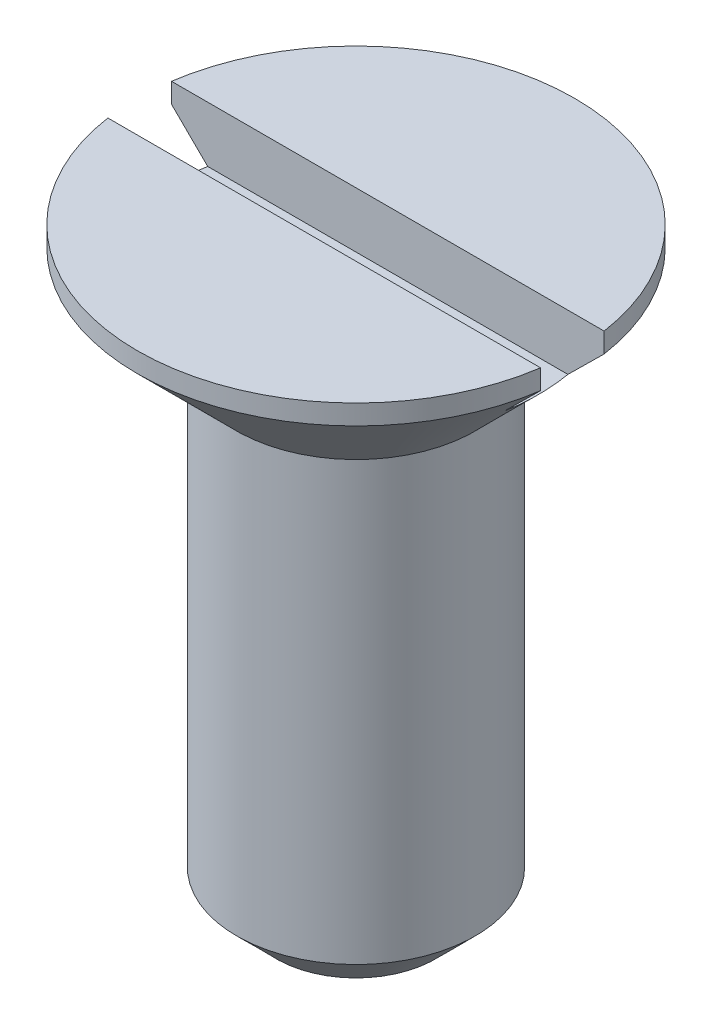
ISO-10303-21;
HEADER;
FILE_DESCRIPTION(('STEP AP214'),'2;1');
FILE_NAME('part.step','',(''),(''),'','','');
FILE_SCHEMA(('AUTOMOTIVE_DESIGN { 1 0 10303 214 1 1 1 1 }'));
ENDSEC;
DATA;
#1=APPLICATION_CONTEXT('core data for automotive mechanical design processes');
#2=APPLICATION_PROTOCOL_DEFINITION('international standard','automotive_design',2000,#1);
#3=PRODUCT_CONTEXT('',#1,'mechanical');
#4=PRODUCT('Part','Part','',(#3));
#5=PRODUCT_RELATED_PRODUCT_CATEGORY('part','',(#4));
#6=PRODUCT_DEFINITION_FORMATION('','',#4);
#7=PRODUCT_DEFINITION_CONTEXT('part definition',#1,'design');
#8=PRODUCT_DEFINITION('design','',#6,#7);
#9=PRODUCT_DEFINITION_SHAPE('','',#8);
#10=(LENGTH_UNIT() NAMED_UNIT(*) SI_UNIT(.MILLI.,.METRE.));
#11=(NAMED_UNIT(*) PLANE_ANGLE_UNIT() SI_UNIT($,.RADIAN.));
#12=(NAMED_UNIT(*) SI_UNIT($,.STERADIAN.) SOLID_ANGLE_UNIT());
#13=UNCERTAINTY_MEASURE_WITH_UNIT(LENGTH_MEASURE(1.E-05),#10,'distance_accuracy_value','');
#14=(GEOMETRIC_REPRESENTATION_CONTEXT(3) GLOBAL_UNCERTAINTY_ASSIGNED_CONTEXT((#13)) GLOBAL_UNIT_ASSIGNED_CONTEXT((#10,
#11,#12)) REPRESENTATION_CONTEXT('',''));
#15=CARTESIAN_POINT('',(0.,0.,0.));
#16=DIRECTION('',(0.,0.,1.));
#17=DIRECTION('',(1.,0.,0.));
#18=AXIS2_PLACEMENT_3D('',#15,#16,#17);
#19=CARTESIAN_POINT('',(0.,125.763182897862,0.));
#20=DIRECTION('',(0.,1.,0.));
#21=DIRECTION('',(-1.,0.,0.));
#22=AXIS2_PLACEMENT_3D('',#19,#20,#21);
#23=CYLINDRICAL_SURFACE('',#22,5.50000000000001);
#24=CARTESIAN_POINT('',(0.,91.5350422227853,0.));
#25=DIRECTION('',(0.,1.,0.));
#26=DIRECTION('',(-1.,0.,0.));
#27=AXIS2_PLACEMENT_3D('',#24,#25,#26);
#28=CIRCLE('',#27,5.50000000000001);
#29=CARTESIAN_POINT('',(5.44150714416512,91.5350422227853,-0.800000000000001));
#30=VERTEX_POINT('',#29);
#31=CARTESIAN_POINT('',(-5.44150714416514,91.5350422227853,-0.799999999999999));
#32=VERTEX_POINT('',#31);
#33=EDGE_CURVE('E103',#30,#32,#28,.T.);
#34=ORIENTED_EDGE('',*,*,#33,.T.);
#35=DIRECTION('',(0.,1.,0.));
#36=VECTOR('',#35,1.);
#37=CARTESIAN_POINT('',(-5.44150714416514,125.763182897862,-0.799999999999999));
#38=LINE('',#37,#36);
#39=CARTESIAN_POINT('',(-5.44150714416513,92.0350422227854,-0.799999999999999));
#40=VERTEX_POINT('',#39);
#41=EDGE_CURVE('E136',#32,#40,#38,.T.);
#42=ORIENTED_EDGE('',*,*,#41,.T.);
#43=CARTESIAN_POINT('',(0.,92.0350422227854,0.));
#44=DIRECTION('',(0.,1.,0.));
#45=DIRECTION('',(-1.,0.,0.));
#46=AXIS2_PLACEMENT_3D('',#43,#44,#45);
#47=CIRCLE('',#46,5.50000000000001);
#48=CARTESIAN_POINT('',(5.44150714416512,92.0350422227854,-0.800000000000001));
#49=VERTEX_POINT('',#48);
#50=EDGE_CURVE('E100',#49,#40,#47,.T.);
#51=ORIENTED_EDGE('',*,*,#50,.F.);
#52=DIRECTION('',(0.,1.,0.));
#53=VECTOR('',#52,1.);
#54=CARTESIAN_POINT('',(5.44150714416512,125.763182897862,-0.800000000000001));
#55=LINE('',#54,#53);
#56=EDGE_CURVE('E106',#49,#30,#55,.F.);
#57=ORIENTED_EDGE('',*,*,#56,.T.);
#58=EDGE_LOOP('',(#34,#42,#51,#57));
#59=FACE_BOUND('',#58,.T.);
#60=ADVANCED_FACE('F29',(#59),#23,.T.);
#61=CARTESIAN_POINT('',(0.,92.0350422227854,0.));
#62=DIRECTION('',(0.,-1.,0.));
#63=DIRECTION('',(1.,0.,0.));
#64=AXIS2_PLACEMENT_3D('',#61,#62,#63);
#65=PLANE('',#64);
#66=ORIENTED_EDGE('',*,*,#50,.T.);
#67=DIRECTION('',(1.,0.,0.));
#68=VECTOR('',#67,1.);
#69=CARTESIAN_POINT('',(0.,92.0350422227854,-0.8));
#70=LINE('',#69,#68);
#71=EDGE_CURVE('E88',#40,#49,#70,.T.);
#72=ORIENTED_EDGE('',*,*,#71,.T.);
#73=EDGE_LOOP('',(#66,#72));
#74=FACE_BOUND('',#73,.T.);
#75=ADVANCED_FACE('F162',(#74),#65,.F.);
#76=CARTESIAN_POINT('',(-5.44150714416514,91.5350422227853,0.800000000000001));
#77=VERTEX_POINT('',#76);
#78=CARTESIAN_POINT('',(5.44150714416512,91.5350422227853,0.799999999999999));
#79=VERTEX_POINT('',#78);
#80=EDGE_CURVE('E89',#77,#79,#28,.T.);
#81=ORIENTED_EDGE('',*,*,#80,.T.);
#82=DIRECTION('',(0.,1.,0.));
#83=VECTOR('',#82,1.);
#84=CARTESIAN_POINT('',(5.44150714416512,125.763182897862,0.799999999999999));
#85=LINE('',#84,#83);
#86=CARTESIAN_POINT('',(5.44150714416512,92.0350422227854,0.799999999999999));
#87=VERTEX_POINT('',#86);
#88=EDGE_CURVE('E83',#79,#87,#85,.T.);
#89=ORIENTED_EDGE('',*,*,#88,.T.);
#90=CARTESIAN_POINT('',(-5.44150714416513,92.0350422227854,0.800000000000001));
#91=VERTEX_POINT('',#90);
#92=EDGE_CURVE('E93',#91,#87,#47,.T.);
#93=ORIENTED_EDGE('',*,*,#92,.F.);
#94=DIRECTION('',(0.,1.,0.));
#95=VECTOR('',#94,1.);
#96=CARTESIAN_POINT('',(-5.44150714416514,125.763182897862,0.800000000000001));
#97=LINE('',#96,#95);
#98=EDGE_CURVE('E44',#91,#77,#97,.F.);
#99=ORIENTED_EDGE('',*,*,#98,.T.);
#100=EDGE_LOOP('',(#81,#89,#93,#99));
#101=FACE_BOUND('',#100,.T.);
#102=ADVANCED_FACE('F31',(#101),#23,.T.);
#103=CARTESIAN_POINT('',(0.,89.0350422227853,0.));
#104=DIRECTION('',(0.,1.,0.));
#105=DIRECTION('',(-1.,0.,0.));
#106=AXIS2_PLACEMENT_3D('',#103,#104,#105);
#107=CONICAL_SURFACE('',#106,3.00000000000001,0.785398163397448);
#108=ORIENTED_EDGE('',*,*,#33,.F.);
#109=CARTESIAN_POINT('',(12.0958275262002,98.1572962847815,-0.800000000000001));
#110=CARTESIAN_POINT('',(11.6791372892174,97.7415215826676,-0.800000000000001));
#111=CARTESIAN_POINT('',(11.262407013586,97.3257869805094,-0.800000000000001));
#112=CARTESIAN_POINT('',(10.4288064089983,96.4944409069096,-0.800000000000001));
#113=CARTESIAN_POINT('',(10.0119360773137,96.0788294382037,-0.800000000000001));
#114=CARTESIAN_POINT('',(9.17781661346985,95.2475944397484,-0.800000000000001));
#115=CARTESIAN_POINT('',(8.76056739536413,94.831970996228,-0.800000000000001));
#116=CARTESIAN_POINT('',(7.92579826190202,94.001012925459,-0.800000000000001));
#117=CARTESIAN_POINT('',(7.50827835219483,93.5856782925356,-0.800000000000001));
#118=CARTESIAN_POINT('',(6.66859020063421,92.7512768926174,-0.800000000000001));
#119=CARTESIAN_POINT('',(6.24641747129162,92.3322146386244,-0.800000000000001));
#120=CARTESIAN_POINT('',(5.61252961614655,91.7042292336917,-0.800000000000001));
#121=CARTESIAN_POINT('',(5.40112222087695,91.49499553239,-0.800000000000001));
#122=CARTESIAN_POINT('',(4.97801512356286,91.0768264844013,-0.800000000000001));
#123=CARTESIAN_POINT('',(4.76631542336044,90.8678911358507,-0.800000000000001));
#124=CARTESIAN_POINT('',(4.34255119804019,90.4505148402451,-0.800000000000001));
#125=CARTESIAN_POINT('',(4.13048679820865,90.2420737661013,-0.8));
#126=CARTESIAN_POINT('',(3.70568926936662,89.8258638515093,-0.8));
#127=CARTESIAN_POINT('',(3.49295612440394,89.6180950273405,-0.8));
#128=CARTESIAN_POINT('',(3.06642735602863,89.203693770451,-0.8));
#129=CARTESIAN_POINT('',(2.85263185208169,88.9970612152226,-0.8));
#130=CARTESIAN_POINT('',(2.53040594426324,88.6887211014235,-0.8));
#131=CARTESIAN_POINT('',(2.42274398077204,88.5862111666668,-0.8));
#132=CARTESIAN_POINT('',(2.20667154342435,88.381983944839,-0.8));
#133=CARTESIAN_POINT('',(2.09826108039959,88.2802666463425,-0.8));
#134=CARTESIAN_POINT('',(1.93012261572953,88.1242748325973,-0.8));
#135=CARTESIAN_POINT('',(1.87079515267859,88.0695688501408,-0.8));
#136=CARTESIAN_POINT('',(1.75170454598611,87.9606297428371,-0.8));
#137=CARTESIAN_POINT('',(1.691941392756,87.9063966284546,-0.8));
#138=CARTESIAN_POINT('',(1.57185035487716,87.7985656103778,-0.8));
#139=CARTESIAN_POINT('',(1.51152250462597,87.7449676684379,-0.8));
#140=CARTESIAN_POINT('',(1.39010636610856,87.6386421055215,-0.8));
#141=CARTESIAN_POINT('',(1.32901811231746,87.5859144453384,-0.8));
#142=CARTESIAN_POINT('',(1.22110258949384,87.4946595611788,-0.8));
#143=CARTESIAN_POINT('',(1.17450544952835,87.4558608083995,-0.8));
#144=CARTESIAN_POINT('',(1.08053310046028,87.3792189105197,-0.8));
#145=CARTESIAN_POINT('',(1.03315793637708,87.3413757104465,-0.8));
#146=CARTESIAN_POINT('',(0.937335315959471,87.2669844593189,-0.8));
#147=CARTESIAN_POINT('',(0.888887046591645,87.2304374489248,-0.8));
#148=CARTESIAN_POINT('',(0.790599923251047,87.1592755180035,-0.8));
#149=CARTESIAN_POINT('',(0.740761470882523,87.1246600479767,-0.8));
#150=CARTESIAN_POINT('',(0.629334035248598,87.0518666759528,-0.8));
#151=CARTESIAN_POINT('',(0.567339937782394,87.0142988477261,-0.8));
#152=CARTESIAN_POINT('',(0.439504114180291,86.9462180718728,-0.8));
#153=CARTESIAN_POINT('',(0.37366936762007,86.9156927972694,-0.8));
#154=CARTESIAN_POINT('',(0.258743036693742,86.8747196206057,-0.8));
#155=CARTESIAN_POINT('',(0.210872557785138,86.8609775664057,-0.8));
#156=CARTESIAN_POINT('',(0.113581927406563,86.8416725155943,-0.8));
#157=CARTESIAN_POINT('',(0.0641678120705799,86.836080949733,-0.8));
#158=CARTESIAN_POINT('',(-0.0350904401592112,86.8342676856272,-0.8));
#159=CARTESIAN_POINT('',(-0.0849354933242964,86.8380927493839,-0.8));
#160=CARTESIAN_POINT('',(-0.183253006607992,86.8543125472453,-0.8));
#161=CARTESIAN_POINT('',(-0.23172141942561,86.8667302766003,-0.8));
#162=CARTESIAN_POINT('',(-0.328201336074364,86.8984972300914,-0.8));
#163=CARTESIAN_POINT('',(-0.376131007814257,86.9180837874778,-0.8));
#164=CARTESIAN_POINT('',(-0.469859968725569,86.9618903544032,-0.8));
#165=CARTESIAN_POINT('',(-0.515655200140517,86.9861187748849,-0.8));
#166=CARTESIAN_POINT('',(-0.605816891933558,87.0378591148949,-0.8));
#167=CARTESIAN_POINT('',(-0.650168610045637,87.0653962598678,-0.8));
#168=CARTESIAN_POINT('',(-0.737426470346453,87.1225692235801,-0.8));
#169=CARTESIAN_POINT('',(-0.780333816480496,87.1522032271962,-0.8));
#170=CARTESIAN_POINT('',(-0.868736948412851,87.2155817657817,-0.8));
#171=CARTESIAN_POINT('',(-0.914136036146888,87.2494602261302,-0.8));
#172=CARTESIAN_POINT('',(-1.00398332100103,87.3184596561436,-0.8));
#173=CARTESIAN_POINT('',(-1.04843138737396,87.3535807949139,-0.8));
#174=CARTESIAN_POINT('',(-1.18073892841146,87.4603132765048,-0.8));
#175=CARTESIAN_POINT('',(-1.26751723571054,87.533260654317,-0.8));
#176=CARTESIAN_POINT('',(-1.4394711844844,87.6813088714842,-0.8));
#177=CARTESIAN_POINT('',(-1.52464359732235,87.7564134124352,-0.8));
#178=CARTESIAN_POINT('',(-1.69380590081402,87.9078909999617,-0.8));
#179=CARTESIAN_POINT('',(-1.77779613016842,87.9842636689578,-0.8));
#180=CARTESIAN_POINT('',(-1.94473042754187,88.1376356698917,-0.8));
#181=CARTESIAN_POINT('',(-2.02767689634403,88.2146323977702,-0.8));
#182=CARTESIAN_POINT('',(-2.1930126401925,88.3692331860143,-0.8));
#183=CARTESIAN_POINT('',(-2.27540187388798,88.4468372905496,-0.8));
#184=CARTESIAN_POINT('',(-2.43967433471674,88.602398051522,-0.8));
#185=CARTESIAN_POINT('',(-2.52155801918567,88.680354225575,-0.8));
#186=CARTESIAN_POINT('',(-2.68500793782888,88.8365943696214,-0.8));
#187=CARTESIAN_POINT('',(-2.76657417984415,88.9148783314178,-0.8));
#188=CARTESIAN_POINT('',(-3.01014515950732,89.1493693494808,-0.8));
#189=CARTESIAN_POINT('',(-3.17179220340449,89.3059478221063,-0.8));
#190=CARTESIAN_POINT('',(-3.49447839328541,89.6197302278361,-0.8));
#191=CARTESIAN_POINT('',(-3.65551753661504,89.7769341636652,-0.8));
#192=CARTESIAN_POINT('',(-4.13803429466081,90.2491722298893,-0.8));
#193=CARTESIAN_POINT('',(-4.45890481049126,90.564826393352,-0.799999999999999));
#194=CARTESIAN_POINT('',(-5.09996114740416,91.1971060949273,-0.799999999999999));
#195=CARTESIAN_POINT('',(-5.42014660990474,91.5137319958748,-0.799999999999999));
#196=CARTESIAN_POINT('',(-6.0600203413012,92.1474797989783,-0.799999999999999));
#197=CARTESIAN_POINT('',(-6.37970861482775,92.4646016964588,-0.799999999999999));
#198=CARTESIAN_POINT('',(-7.01874857086325,93.099135144032,-0.799999999999999));
#199=CARTESIAN_POINT('',(-7.33810027738054,93.4165466699576,-0.799999999999999));
#200=CARTESIAN_POINT('',(-7.97659251223353,94.0515836009857,-0.799999999999999));
#201=CARTESIAN_POINT('',(-8.29573304004776,94.3692090066125,-0.799999999999999));
#202=CARTESIAN_POINT('',(-9.25286524024317,95.3222371870014,-0.799999999999999));
#203=CARTESIAN_POINT('',(-9.89063691675411,95.9578608876388,-0.799999999999999));
#204=CARTESIAN_POINT('',(-10.6589067290098,96.7239244030984,-0.799999999999999));
#205=CARTESIAN_POINT('',(-10.7895564808174,96.8542122457665,-0.799999999999999));
#206=CARTESIAN_POINT('',(-11.0508453982938,97.1148026358098,-0.799999999999999));
#207=CARTESIAN_POINT('',(-11.1814845637648,97.245105183383,-0.799999999999999));
#208=CARTESIAN_POINT('',(-11.4427478912807,97.5057176577888,-0.799999999999999));
#209=CARTESIAN_POINT('',(-11.5733720536532,97.636027584293,-0.799999999999999));
#210=CARTESIAN_POINT('',(-11.8346081759352,97.8966555755888,-0.799999999999999));
#211=CARTESIAN_POINT('',(-11.9652201360038,98.0269736402209,-0.799999999999998));
#212=CARTESIAN_POINT('',(-12.0958275262002,98.1572962847815,-0.799999999999999));
#213=B_SPLINE_CURVE_WITH_KNOTS('',3,(#109,#110,#111,#112,#113,#114,#115,#116,#117,#118,#119,
#120,#121,#122,#123,#124,#125,#126,#127,#128,#129,#130,#131,#132,#133,#134,#135,#136,#137,#138,
#139,#140,#141,#142,#143,#144,#145,#146,#147,#148,#149,#150,#151,#152,#153,#154,#155,#156,#157,
#158,#159,#160,#161,#162,#163,#164,#165,#166,#167,#168,#169,#170,#171,#172,#173,#174,#175,#176,
#177,#178,#179,#180,#181,#182,#183,#184,#185,#186,#187,#188,#189,#190,#191,#192,#193,#194,#195,
#196,#197,#198,#199,#200,#201,#202,#203,#204,#205,#206,#207,#208,#209,#210,#211,#212),
.UNSPECIFIED.,.F.,.F.,(4,2,2,2,2,2,2,2,2,2,2,2,2,2,2,2,2,2,2,2,2,2,2,2,2,2,2,2,2,2,2,2,2,2,2,2,
2,2,2,2,2,2,2,2,2,2,2,2,2,2,2,4),(0.,1.7659259029987,3.53188847173551,5.29868145901929,
7.06543869037486,8.849979011941,9.74230522915776,10.6346258484434,11.526684619259,
12.4187648331258,13.3107469028989,13.7567205444878,14.2026877457437,14.4447859615782,
14.6868895216316,14.9289784291063,15.1710564004659,15.3529532463517,15.5348396038383,
15.7168688291973,15.8988460026461,16.1160971845527,16.3329651646567,16.4818476866973,
16.6302070773488,16.7793046899972,16.9288028610127,17.0837794880115,17.2390396311443,
17.3955691356675,17.5519647617409,17.7218741892633,17.8918068278933,18.2318382348004,
18.572492810384,18.9130477144395,19.2525694556765,19.5921161213406,19.9312888470232,
20.270453141111,20.9455938509771,21.6207375051469,22.9710516567342,24.3219532270977,
25.6728421392951,27.0236270977012,28.3744153793802,31.0756984573674,31.6292312195474,
32.1827726428839,32.7362978349177,33.2898143552011),.UNSPECIFIED.);
#214=CARTESIAN_POINT('',(4.52990066116246,90.6350422227854,-0.800000000000001));
#215=VERTEX_POINT('',#214);
#216=EDGE_CURVE('E52',#30,#215,#213,.T.);
#217=ORIENTED_EDGE('',*,*,#216,.T.);
#218=CARTESIAN_POINT('',(0.,90.6350422227854,0.));
#219=DIRECTION('',(0.,1.,0.));
#220=DIRECTION('',(0.,0.,1.));
#221=AXIS2_PLACEMENT_3D('',#218,#219,#220);
#222=CIRCLE('',#221,4.60000000000001);
#223=CARTESIAN_POINT('',(4.52990066116246,90.6350422227854,0.799999999999999));
#224=VERTEX_POINT('',#223);
#225=EDGE_CURVE('E115',#224,#215,#222,.T.);
#226=ORIENTED_EDGE('',*,*,#225,.F.);
#227=CARTESIAN_POINT('',(-12.0958275262002,98.1572962847815,0.800000000000001));
#228=CARTESIAN_POINT('',(-11.6791372892174,97.7415215826676,0.800000000000001));
#229=CARTESIAN_POINT('',(-11.2624070135861,97.3257869805094,0.800000000000001));
#230=CARTESIAN_POINT('',(-10.4288064089984,96.4944409069096,0.800000000000001));
#231=CARTESIAN_POINT('',(-10.0119360773137,96.0788294382037,0.800000000000001));
#232=CARTESIAN_POINT('',(-9.17781661346986,95.2475944397484,0.800000000000001));
#233=CARTESIAN_POINT('',(-8.76056739536414,94.831970996228,0.800000000000001));
#234=CARTESIAN_POINT('',(-7.92579826190204,94.001012925459,0.800000000000001));
#235=CARTESIAN_POINT('',(-7.50827835219485,93.5856782925356,0.800000000000001));
#236=CARTESIAN_POINT('',(-6.66859020063422,92.7512768926174,0.800000000000001));
#237=CARTESIAN_POINT('',(-6.24641747129163,92.3322146386244,0.800000000000001));
#238=CARTESIAN_POINT('',(-5.61252961614657,91.7042292336917,0.800000000000001));
#239=CARTESIAN_POINT('',(-5.40112222087697,91.49499553239,0.800000000000001));
#240=CARTESIAN_POINT('',(-4.97801512356287,91.0768264844013,0.800000000000001));
#241=CARTESIAN_POINT('',(-4.76631542336046,90.8678911358507,0.8));
#242=CARTESIAN_POINT('',(-4.3425511980402,90.4505148402451,0.8));
#243=CARTESIAN_POINT('',(-4.13048679820866,90.2420737661013,0.8));
#244=CARTESIAN_POINT('',(-3.70568926936663,89.8258638515093,0.8));
#245=CARTESIAN_POINT('',(-3.49295612440395,89.6180950273405,0.8));
#246=CARTESIAN_POINT('',(-3.06642735602864,89.203693770451,0.8));
#247=CARTESIAN_POINT('',(-2.8526318520817,88.9970612152226,0.8));
#248=CARTESIAN_POINT('',(-2.53040594426326,88.6887211014235,0.8));
#249=CARTESIAN_POINT('',(-2.42274398077206,88.5862111666668,0.8));
#250=CARTESIAN_POINT('',(-2.20667154342437,88.381983944839,0.8));
#251=CARTESIAN_POINT('',(-2.09826108039961,88.2802666463425,0.8));
#252=CARTESIAN_POINT('',(-1.93012261572954,88.1242748325973,0.8));
#253=CARTESIAN_POINT('',(-1.8707951526786,88.0695688501408,0.8));
#254=CARTESIAN_POINT('',(-1.75170454598612,87.9606297428371,0.8));
#255=CARTESIAN_POINT('',(-1.69194139275601,87.9063966284546,0.8));
#256=CARTESIAN_POINT('',(-1.57185035487717,87.7985656103778,0.8));
#257=CARTESIAN_POINT('',(-1.51152250462598,87.7449676684379,0.8));
#258=CARTESIAN_POINT('',(-1.39010636610857,87.6386421055214,0.8));
#259=CARTESIAN_POINT('',(-1.32901811231746,87.5859144453384,0.8));
#260=CARTESIAN_POINT('',(-1.22110258949385,87.4946595611788,0.8));
#261=CARTESIAN_POINT('',(-1.17450544952835,87.4558608083995,0.8));
#262=CARTESIAN_POINT('',(-1.08053310046029,87.3792189105197,0.8));
#263=CARTESIAN_POINT('',(-1.03315793637708,87.3413757104465,0.8));
#264=CARTESIAN_POINT('',(-0.93733531595947,87.2669844593189,0.8));
#265=CARTESIAN_POINT('',(-0.888887046591645,87.2304374489248,0.8));
#266=CARTESIAN_POINT('',(-0.790599923251052,87.1592755180035,0.8));
#267=CARTESIAN_POINT('',(-0.740761470882531,87.1246600479767,0.8));
#268=CARTESIAN_POINT('',(-0.629334035248611,87.0518666759528,0.8));
#269=CARTESIAN_POINT('',(-0.567339937782408,87.0142988477261,0.8));
#270=CARTESIAN_POINT('',(-0.439504114180306,86.9462180718728,0.8));
#271=CARTESIAN_POINT('',(-0.373669367620083,86.9156927972694,0.8));
#272=CARTESIAN_POINT('',(-0.258743036693755,86.8747196206057,0.8));
#273=CARTESIAN_POINT('',(-0.21087255778515,86.8609775664057,0.8));
#274=CARTESIAN_POINT('',(-0.113581927406576,86.8416725155943,0.8));
#275=CARTESIAN_POINT('',(-0.0641678120705924,86.836080949733,0.8));
#276=CARTESIAN_POINT('',(0.0350904401591986,86.8342676856272,0.8));
#277=CARTESIAN_POINT('',(0.0849354933242838,86.8380927493839,0.8));
#278=CARTESIAN_POINT('',(0.183253006607979,86.8543125472453,0.8));
#279=CARTESIAN_POINT('',(0.231721419425598,86.8667302766003,0.8));
#280=CARTESIAN_POINT('',(0.328201336074352,86.8984972300914,0.8));
#281=CARTESIAN_POINT('',(0.376131007814245,86.9180837874778,0.8));
#282=CARTESIAN_POINT('',(0.469859968725557,86.9618903544032,0.8));
#283=CARTESIAN_POINT('',(0.515655200140506,86.9861187748849,0.8));
#284=CARTESIAN_POINT('',(0.605816891933547,87.0378591148949,0.8));
#285=CARTESIAN_POINT('',(0.650168610045625,87.0653962598678,0.8));
#286=CARTESIAN_POINT('',(0.73742647034644,87.1225692235801,0.8));
#287=CARTESIAN_POINT('',(0.780333816480482,87.1522032271962,0.8));
#288=CARTESIAN_POINT('',(0.868736948412836,87.2155817657817,0.8));
#289=CARTESIAN_POINT('',(0.914136036146873,87.2494602261302,0.8));
#290=CARTESIAN_POINT('',(1.00398332100101,87.3184596561436,0.8));
#291=CARTESIAN_POINT('',(1.04843138737394,87.3535807949138,0.8));
#292=CARTESIAN_POINT('',(1.18073892841143,87.4603132765048,0.8));
#293=CARTESIAN_POINT('',(1.26751723571053,87.533260654317,0.8));
#294=CARTESIAN_POINT('',(1.4394711844844,87.6813088714842,0.8));
#295=CARTESIAN_POINT('',(1.52464359732235,87.7564134124352,0.8));
#296=CARTESIAN_POINT('',(1.69380590081401,87.9078909999617,0.8));
#297=CARTESIAN_POINT('',(1.77779613016841,87.9842636689578,0.8));
#298=CARTESIAN_POINT('',(1.94473042754187,88.1376356698917,0.8));
#299=CARTESIAN_POINT('',(2.02767689634403,88.2146323977702,0.8));
#300=CARTESIAN_POINT('',(2.19301264019249,88.3692331860144,0.8));
#301=CARTESIAN_POINT('',(2.27540187388797,88.4468372905496,0.8));
#302=CARTESIAN_POINT('',(2.43967433471673,88.602398051522,0.8));
#303=CARTESIAN_POINT('',(2.52155801918566,88.680354225575,0.8));
#304=CARTESIAN_POINT('',(2.68500793782887,88.8365943696214,0.8));
#305=CARTESIAN_POINT('',(2.76657417984414,88.9148783314178,0.8));
#306=CARTESIAN_POINT('',(3.01014515950731,89.1493693494808,0.8));
#307=CARTESIAN_POINT('',(3.17179220340447,89.3059478221063,0.799999999999999));
#308=CARTESIAN_POINT('',(3.4944783932854,89.6197302278361,0.799999999999999));
#309=CARTESIAN_POINT('',(3.65551753661503,89.7769341636652,0.799999999999999));
#310=CARTESIAN_POINT('',(4.13803429466079,90.2491722298893,0.799999999999999));
#311=CARTESIAN_POINT('',(4.45890481049124,90.564826393352,0.799999999999999));
#312=CARTESIAN_POINT('',(5.09996114740414,91.1971060949273,0.799999999999999));
#313=CARTESIAN_POINT('',(5.42014660990471,91.5137319958748,0.799999999999999));
#314=CARTESIAN_POINT('',(6.06002034130117,92.1474797989783,0.799999999999999));
#315=CARTESIAN_POINT('',(6.37970861482772,92.4646016964588,0.799999999999999));
#316=CARTESIAN_POINT('',(7.01874857086323,93.099135144032,0.799999999999999));
#317=CARTESIAN_POINT('',(7.33810027738052,93.4165466699575,0.799999999999999));
#318=CARTESIAN_POINT('',(7.97659251223351,94.0515836009857,0.799999999999999));
#319=CARTESIAN_POINT('',(8.29573304004773,94.3692090066125,0.799999999999999));
#320=CARTESIAN_POINT('',(9.25286524024315,95.3222371870014,0.799999999999999));
#321=CARTESIAN_POINT('',(9.89063691675408,95.9578608876389,0.799999999999999));
#322=CARTESIAN_POINT('',(10.6589067290098,96.7239244030984,0.799999999999999));
#323=CARTESIAN_POINT('',(10.7895564808174,96.8542122457665,0.799999999999999));
#324=CARTESIAN_POINT('',(11.0508453982938,97.1148026358098,0.799999999999999));
#325=CARTESIAN_POINT('',(11.1814845637648,97.245105183383,0.799999999999999));
#326=CARTESIAN_POINT('',(11.4427478912807,97.5057176577888,0.799999999999999));
#327=CARTESIAN_POINT('',(11.5733720536532,97.636027584293,0.799999999999998));
#328=CARTESIAN_POINT('',(11.8346081759352,97.8966555755888,0.799999999999998));
#329=CARTESIAN_POINT('',(11.9652201360038,98.0269736402209,0.799999999999998));
#330=CARTESIAN_POINT('',(12.0958275262002,98.1572962847815,0.799999999999998));
#331=B_SPLINE_CURVE_WITH_KNOTS('',3,(#227,#228,#229,#230,#231,#232,#233,#234,#235,#236,#237,
#238,#239,#240,#241,#242,#243,#244,#245,#246,#247,#248,#249,#250,#251,#252,#253,#254,#255,#256,
#257,#258,#259,#260,#261,#262,#263,#264,#265,#266,#267,#268,#269,#270,#271,#272,#273,#274,#275,
#276,#277,#278,#279,#280,#281,#282,#283,#284,#285,#286,#287,#288,#289,#290,#291,#292,#293,#294,
#295,#296,#297,#298,#299,#300,#301,#302,#303,#304,#305,#306,#307,#308,#309,#310,#311,#312,#313,
#314,#315,#316,#317,#318,#319,#320,#321,#322,#323,#324,#325,#326,#327,#328,#329,#330),
.UNSPECIFIED.,.F.,.F.,(4,2,2,2,2,2,2,2,2,2,2,2,2,2,2,2,2,2,2,2,2,2,2,2,2,2,2,2,2,2,2,2,2,2,2,2,
2,2,2,2,2,2,2,2,2,2,2,2,2,2,2,4),(0.,1.7659259029987,3.53188847173551,5.29868145901929,
7.06543869037486,8.849979011941,9.74230522915776,10.6346258484434,11.526684619259,
12.4187648331258,13.3107469028989,13.7567205444878,14.2026877457437,14.4447859615782,
14.6868895216316,14.9289784291063,15.1710564004659,15.3529532463517,15.5348396038383,
15.7168688291974,15.8988460026461,16.1160971845527,16.3329651646567,16.4818476866973,
16.6302070773488,16.7793046899972,16.9288028610127,17.0837794880115,17.2390396311443,
17.3955691356675,17.5519647617409,17.7218741892633,17.8918068278933,18.2318382348004,
18.572492810384,18.9130477144395,19.2525694556765,19.5921161213406,19.9312888470232,
20.270453141111,20.9455938509771,21.6207375051469,22.9710516567342,24.3219532270977,
25.6728421392951,27.0236270977012,28.3744153793802,31.0756984573674,31.6292312195475,
32.1827726428839,32.7362978349176,33.2898143552011),.UNSPECIFIED.);
#332=EDGE_CURVE('E96',#224,#79,#331,.T.);
#333=ORIENTED_EDGE('',*,*,#332,.T.);
#334=ORIENTED_EDGE('',*,*,#80,.F.);
#335=CARTESIAN_POINT('',(-4.52990066116247,90.6350422227854,0.8));
#336=VERTEX_POINT('',#335);
#337=EDGE_CURVE('E95',#77,#336,#331,.T.);
#338=ORIENTED_EDGE('',*,*,#337,.T.);
#339=CARTESIAN_POINT('',(-4.52990066116247,90.6350422227854,-0.799999999999999));
#340=VERTEX_POINT('',#339);
#341=EDGE_CURVE('E114',#340,#336,#222,.T.);
#342=ORIENTED_EDGE('',*,*,#341,.F.);
#343=EDGE_CURVE('E131',#340,#32,#213,.T.);
#344=ORIENTED_EDGE('',*,*,#343,.T.);
#345=EDGE_LOOP('',(#108,#217,#226,#333,#334,#338,#342,#344));
#346=FACE_BOUND('',#345,.T.);
#347=CARTESIAN_POINT('',(0.,89.0350422227853,0.));
#348=DIRECTION('',(0.,1.,0.));
#349=DIRECTION('',(-1.,0.,0.));
#350=AXIS2_PLACEMENT_3D('',#347,#348,#349);
#351=CIRCLE('',#350,3.00000000000001);
#352=CARTESIAN_POINT('',(-3.00000000000002,89.0350422227853,0.));
#353=VERTEX_POINT('',#352);
#354=EDGE_CURVE('E99',#353,#353,#351,.T.);
#355=ORIENTED_EDGE('',*,*,#354,.T.);
#356=EDGE_LOOP('',(#355));
#357=FACE_BOUND('',#356,.T.);
#358=ADVANCED_FACE('F134',(#346,#357),#107,.T.);
#359=CARTESIAN_POINT('',(0.,125.763182897862,0.));
#360=DIRECTION('',(0.,1.,0.));
#361=DIRECTION('',(-1.,0.,0.));
#362=AXIS2_PLACEMENT_3D('',#359,#360,#361);
#363=CYLINDRICAL_SURFACE('',#362,3.00000000000001);
#364=CARTESIAN_POINT('',(0.,78.0350422227853,0.));
#365=DIRECTION('',(0.,1.,0.));
#366=DIRECTION('',(-1.,0.,0.));
#367=AXIS2_PLACEMENT_3D('',#364,#365,#366);
#368=CIRCLE('',#367,3.00000000000001);
#369=CARTESIAN_POINT('',(-3.00000000000002,78.0350422227853,0.));
#370=VERTEX_POINT('',#369);
#371=EDGE_CURVE('E37',#370,#370,#368,.T.);
#372=ORIENTED_EDGE('',*,*,#371,.T.);
#373=EDGE_LOOP('',(#372));
#374=FACE_BOUND('',#373,.T.);
#375=ORIENTED_EDGE('',*,*,#354,.F.);
#376=EDGE_LOOP('',(#375));
#377=FACE_BOUND('',#376,.T.);
#378=ADVANCED_FACE('F164',(#374,#377),#363,.T.);
#379=CARTESIAN_POINT('',(3.00000000000001,77.0350422227854,0.));
#380=DIRECTION('',(0.,1.,0.));
#381=DIRECTION('',(-1.,0.,0.));
#382=AXIS2_PLACEMENT_3D('',#379,#380,#381);
#383=PLANE('',#382);
#384=CARTESIAN_POINT('',(0.,77.0350422227854,0.));
#385=DIRECTION('',(0.,1.,0.));
#386=DIRECTION('',(-1.,0.,0.));
#387=AXIS2_PLACEMENT_3D('',#384,#385,#386);
#388=CIRCLE('',#387,2.00000000000002);
#389=CARTESIAN_POINT('',(-2.00000000000002,77.0350422227854,0.));
#390=VERTEX_POINT('',#389);
#391=EDGE_CURVE('E11',#390,#390,#388,.F.);
#392=ORIENTED_EDGE('',*,*,#391,.T.);
#393=EDGE_LOOP('',(#392));
#394=FACE_BOUND('',#393,.T.);
#395=ADVANCED_FACE('F161',(#394),#383,.F.);
#396=ORIENTED_EDGE('',*,*,#92,.T.);
#397=DIRECTION('',(-1.,0.,0.));
#398=VECTOR('',#397,1.);
#399=CARTESIAN_POINT('',(0.,92.0350422227854,0.8));
#400=LINE('',#399,#398);
#401=EDGE_CURVE('E80',#87,#91,#400,.T.);
#402=ORIENTED_EDGE('',*,*,#401,.T.);
#403=EDGE_LOOP('',(#396,#402));
#404=FACE_BOUND('',#403,.T.);
#405=ADVANCED_FACE('F98',(#404),#65,.F.);
#406=CARTESIAN_POINT('',(-5.50000000000001,90.6350422227854,0.800000000000001));
#407=DIRECTION('',(0.,1.,0.));
#408=DIRECTION('',(0.,0.,1.));
#409=AXIS2_PLACEMENT_3D('',#406,#407,#408);
#410=PLANE('',#409);
#411=ORIENTED_EDGE('',*,*,#225,.T.);
#412=DIRECTION('',(-1.,0.,0.));
#413=VECTOR('',#412,1.);
#414=CARTESIAN_POINT('',(-5.50000000000001,90.6350422227854,-0.799999999999999));
#415=LINE('',#414,#413);
#416=EDGE_CURVE('E124',#215,#340,#415,.T.);
#417=ORIENTED_EDGE('',*,*,#416,.T.);
#418=ORIENTED_EDGE('',*,*,#341,.T.);
#419=DIRECTION('',(1.,0.,0.));
#420=VECTOR('',#419,1.);
#421=CARTESIAN_POINT('',(-5.50000000000001,90.6350422227854,0.800000000000001));
#422=LINE('',#421,#420);
#423=EDGE_CURVE('E127',#336,#224,#422,.T.);
#424=ORIENTED_EDGE('',*,*,#423,.T.);
#425=EDGE_LOOP('',(#411,#417,#418,#424));
#426=FACE_BOUND('',#425,.T.);
#427=ADVANCED_FACE('F123',(#426),#410,.T.);
#428=CARTESIAN_POINT('',(-5.50000000000001,90.6350422227854,-0.799999999999999));
#429=DIRECTION('',(0.,0.,-1.));
#430=DIRECTION('',(-1.,0.,0.));
#431=AXIS2_PLACEMENT_3D('',#428,#429,#430);
#432=PLANE('',#431);
#433=ORIENTED_EDGE('',*,*,#71,.F.);
#434=ORIENTED_EDGE('',*,*,#41,.F.);
#435=ORIENTED_EDGE('',*,*,#343,.F.);
#436=ORIENTED_EDGE('',*,*,#416,.F.);
#437=ORIENTED_EDGE('',*,*,#216,.F.);
#438=ORIENTED_EDGE('',*,*,#56,.F.);
#439=EDGE_LOOP('',(#433,#434,#435,#436,#437,#438));
#440=FACE_BOUND('',#439,.T.);
#441=ADVANCED_FACE('F129',(#440),#432,.F.);
#442=CARTESIAN_POINT('',(-5.50000000000001,90.6350422227854,0.800000000000001));
#443=DIRECTION('',(0.,0.,1.));
#444=DIRECTION('',(1.,0.,0.));
#445=AXIS2_PLACEMENT_3D('',#442,#443,#444);
#446=PLANE('',#445);
#447=ORIENTED_EDGE('',*,*,#401,.F.);
#448=ORIENTED_EDGE('',*,*,#88,.F.);
#449=ORIENTED_EDGE('',*,*,#332,.F.);
#450=ORIENTED_EDGE('',*,*,#423,.F.);
#451=ORIENTED_EDGE('',*,*,#337,.F.);
#452=ORIENTED_EDGE('',*,*,#98,.F.);
#453=EDGE_LOOP('',(#447,#448,#449,#450,#451,#452));
#454=FACE_BOUND('',#453,.T.);
#455=ADVANCED_FACE('F82',(#454),#446,.F.);
#456=CARTESIAN_POINT('',(0.,78.0350422227853,0.));
#457=DIRECTION('',(0.,1.,0.));
#458=DIRECTION('',(-1.,0.,0.));
#459=AXIS2_PLACEMENT_3D('',#456,#457,#458);
#460=CONICAL_SURFACE('',#459,3.00000000000001,0.785398163397451);
#461=ORIENTED_EDGE('',*,*,#391,.F.);
#462=EDGE_LOOP('',(#461));
#463=FACE_BOUND('',#462,.T.);
#464=ORIENTED_EDGE('',*,*,#371,.F.);
#465=EDGE_LOOP('',(#464));
#466=FACE_BOUND('',#465,.T.);
#467=ADVANCED_FACE('F156',(#463,#466),#460,.T.);
#468=CLOSED_SHELL('',(#60,#75,#102,#358,#378,#395,#405,#427,#441,#455,#467));
#469=MANIFOLD_SOLID_BREP('B2',#468);
#470=ADVANCED_BREP_SHAPE_REPRESENTATION('',(#18,#469),#14);
#471=SHAPE_DEFINITION_REPRESENTATION(#9,#470);
ENDSEC;
END-ISO-10303-21;
